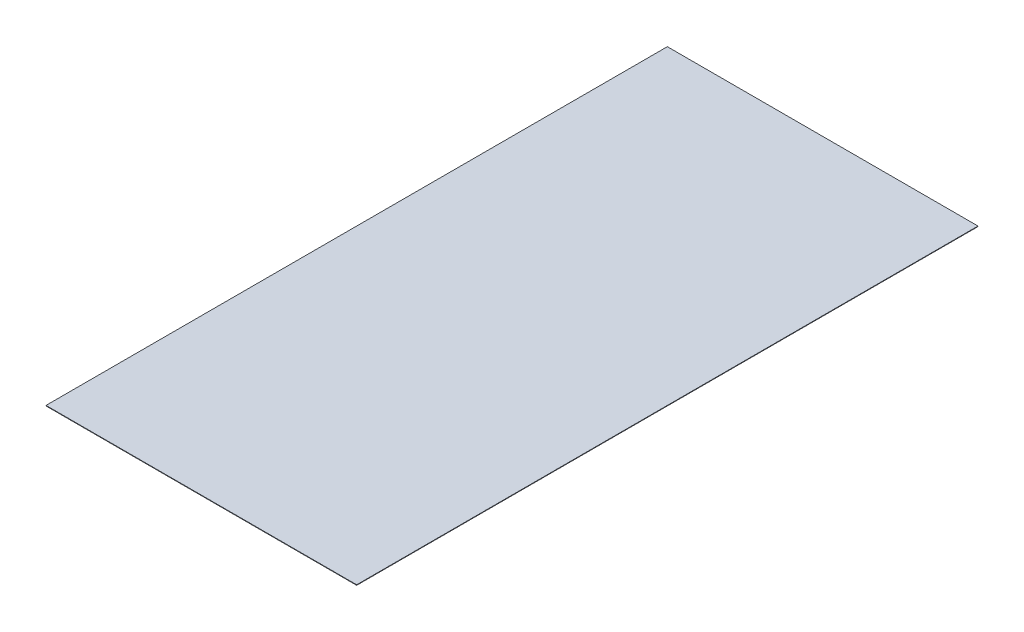
ISO-10303-21;
HEADER;
FILE_DESCRIPTION(('STEP AP214'),'2;1');
FILE_NAME('part.step','',(''),(''),'','','');
FILE_SCHEMA(('AUTOMOTIVE_DESIGN { 1 0 10303 214 1 1 1 1 }'));
ENDSEC;
DATA;
#1=APPLICATION_CONTEXT('core data for automotive mechanical design processes');
#2=APPLICATION_PROTOCOL_DEFINITION('international standard','automotive_design',2000,#1);
#3=PRODUCT_CONTEXT('',#1,'mechanical');
#4=PRODUCT('Part','Part','',(#3));
#5=PRODUCT_RELATED_PRODUCT_CATEGORY('part','',(#4));
#6=PRODUCT_DEFINITION_FORMATION('','',#4);
#7=PRODUCT_DEFINITION_CONTEXT('part definition',#1,'design');
#8=PRODUCT_DEFINITION('design','',#6,#7);
#9=PRODUCT_DEFINITION_SHAPE('','',#8);
#10=(LENGTH_UNIT() NAMED_UNIT(*) SI_UNIT(.MILLI.,.METRE.));
#11=(NAMED_UNIT(*) PLANE_ANGLE_UNIT() SI_UNIT($,.RADIAN.));
#12=(NAMED_UNIT(*) SI_UNIT($,.STERADIAN.) SOLID_ANGLE_UNIT());
#13=UNCERTAINTY_MEASURE_WITH_UNIT(LENGTH_MEASURE(1.E-05),#10,'distance_accuracy_value','');
#14=(GEOMETRIC_REPRESENTATION_CONTEXT(3) GLOBAL_UNCERTAINTY_ASSIGNED_CONTEXT((#13)) GLOBAL_UNIT_ASSIGNED_CONTEXT((#10,
#11,#12)) REPRESENTATION_CONTEXT('',''));
#15=CARTESIAN_POINT('',(0.,0.,0.));
#16=DIRECTION('',(0.,0.,1.));
#17=DIRECTION('',(1.,0.,0.));
#18=AXIS2_PLACEMENT_3D('',#15,#16,#17);
#19=CARTESIAN_POINT('',(609.6,1.9,1219.2));
#20=DIRECTION('',(-1.,0.,0.));
#21=DIRECTION('',(0.,0.,1.));
#22=AXIS2_PLACEMENT_3D('',#19,#20,#21);
#23=PLANE('',#22);
#24=DIRECTION('',(0.,0.,-1.));
#25=VECTOR('',#24,1.);
#26=CARTESIAN_POINT('',(609.6,0.,1219.2));
#27=LINE('',#26,#25);
#28=CARTESIAN_POINT('',(609.6,0.,1219.2));
#29=VERTEX_POINT('',#28);
#30=CARTESIAN_POINT('',(609.6,0.,-1219.2));
#31=VERTEX_POINT('',#30);
#32=EDGE_CURVE('E96',#29,#31,#27,.T.);
#33=ORIENTED_EDGE('',*,*,#32,.T.);
#34=DIRECTION('',(0.,-1.,0.));
#35=VECTOR('',#34,1.);
#36=CARTESIAN_POINT('',(609.6,1.9,-1219.2));
#37=LINE('',#36,#35);
#38=CARTESIAN_POINT('',(609.6,1.9,-1219.2));
#39=VERTEX_POINT('',#38);
#40=EDGE_CURVE('E11',#39,#31,#37,.T.);
#41=ORIENTED_EDGE('',*,*,#40,.F.);
#42=DIRECTION('',(0.,0.,-1.));
#43=VECTOR('',#42,1.);
#44=CARTESIAN_POINT('',(609.6,1.9,1219.2));
#45=LINE('',#44,#43);
#46=CARTESIAN_POINT('',(609.6,1.9,1219.2));
#47=VERTEX_POINT('',#46);
#48=EDGE_CURVE('E84',#47,#39,#45,.T.);
#49=ORIENTED_EDGE('',*,*,#48,.F.);
#50=DIRECTION('',(0.,-1.,0.));
#51=VECTOR('',#50,1.);
#52=CARTESIAN_POINT('',(609.6,1.9,1219.2));
#53=LINE('',#52,#51);
#54=EDGE_CURVE('E92',#47,#29,#53,.T.);
#55=ORIENTED_EDGE('',*,*,#54,.T.);
#56=EDGE_LOOP('',(#33,#41,#49,#55));
#57=FACE_BOUND('',#56,.T.);
#58=ADVANCED_FACE('F33',(#57),#23,.F.);
#59=CARTESIAN_POINT('',(-609.6,1.9,-1219.2));
#60=DIRECTION('',(0.,0.,1.));
#61=DIRECTION('',(1.,0.,0.));
#62=AXIS2_PLACEMENT_3D('',#59,#60,#61);
#63=PLANE('',#62);
#64=DIRECTION('',(-1.,0.,0.));
#65=VECTOR('',#64,1.);
#66=CARTESIAN_POINT('',(-609.6,0.,-1219.2));
#67=LINE('',#66,#65);
#68=CARTESIAN_POINT('',(-609.6,0.,-1219.2));
#69=VERTEX_POINT('',#68);
#70=EDGE_CURVE('E88',#31,#69,#67,.T.);
#71=ORIENTED_EDGE('',*,*,#70,.T.);
#72=DIRECTION('',(0.,-1.,0.));
#73=VECTOR('',#72,1.);
#74=CARTESIAN_POINT('',(-609.6,1.9,-1219.2));
#75=LINE('',#74,#73);
#76=CARTESIAN_POINT('',(-609.6,1.9,-1219.2));
#77=VERTEX_POINT('',#76);
#78=EDGE_CURVE('E41',#77,#69,#75,.T.);
#79=ORIENTED_EDGE('',*,*,#78,.F.);
#80=DIRECTION('',(-1.,0.,0.));
#81=VECTOR('',#80,1.);
#82=CARTESIAN_POINT('',(-609.6,1.9,-1219.2));
#83=LINE('',#82,#81);
#84=EDGE_CURVE('E79',#39,#77,#83,.T.);
#85=ORIENTED_EDGE('',*,*,#84,.F.);
#86=ORIENTED_EDGE('',*,*,#40,.T.);
#87=EDGE_LOOP('',(#71,#79,#85,#86));
#88=FACE_BOUND('',#87,.T.);
#89=ADVANCED_FACE('F87',(#88),#63,.F.);
#90=CARTESIAN_POINT('',(-609.6,1.9,1219.2));
#91=DIRECTION('',(1.,0.,0.));
#92=DIRECTION('',(0.,0.,-1.));
#93=AXIS2_PLACEMENT_3D('',#90,#91,#92);
#94=PLANE('',#93);
#95=DIRECTION('',(0.,0.,1.));
#96=VECTOR('',#95,1.);
#97=CARTESIAN_POINT('',(-609.6,0.,1219.2));
#98=LINE('',#97,#96);
#99=CARTESIAN_POINT('',(-609.6,0.,1219.2));
#100=VERTEX_POINT('',#99);
#101=EDGE_CURVE('E66',#69,#100,#98,.T.);
#102=ORIENTED_EDGE('',*,*,#101,.T.);
#103=DIRECTION('',(0.,-1.,0.));
#104=VECTOR('',#103,1.);
#105=CARTESIAN_POINT('',(-609.6,1.9,1219.2));
#106=LINE('',#105,#104);
#107=CARTESIAN_POINT('',(-609.6,1.9,1219.2));
#108=VERTEX_POINT('',#107);
#109=EDGE_CURVE('E89',#108,#100,#106,.T.);
#110=ORIENTED_EDGE('',*,*,#109,.F.);
#111=DIRECTION('',(0.,0.,1.));
#112=VECTOR('',#111,1.);
#113=CARTESIAN_POINT('',(-609.6,1.9,1219.2));
#114=LINE('',#113,#112);
#115=EDGE_CURVE('E82',#77,#108,#114,.T.);
#116=ORIENTED_EDGE('',*,*,#115,.F.);
#117=ORIENTED_EDGE('',*,*,#78,.T.);
#118=EDGE_LOOP('',(#102,#110,#116,#117));
#119=FACE_BOUND('',#118,.T.);
#120=ADVANCED_FACE('F90',(#119),#94,.F.);
#121=CARTESIAN_POINT('',(-609.6,1.9,1219.2));
#122=DIRECTION('',(0.,0.,-1.));
#123=DIRECTION('',(-1.,0.,0.));
#124=AXIS2_PLACEMENT_3D('',#121,#122,#123);
#125=PLANE('',#124);
#126=DIRECTION('',(1.,0.,0.));
#127=VECTOR('',#126,1.);
#128=CARTESIAN_POINT('',(-609.6,0.,1219.2));
#129=LINE('',#128,#127);
#130=EDGE_CURVE('E72',#100,#29,#129,.T.);
#131=ORIENTED_EDGE('',*,*,#130,.T.);
#132=ORIENTED_EDGE('',*,*,#54,.F.);
#133=DIRECTION('',(1.,0.,0.));
#134=VECTOR('',#133,1.);
#135=CARTESIAN_POINT('',(-609.6,1.9,1219.2));
#136=LINE('',#135,#134);
#137=EDGE_CURVE('E49',#108,#47,#136,.T.);
#138=ORIENTED_EDGE('',*,*,#137,.F.);
#139=ORIENTED_EDGE('',*,*,#109,.T.);
#140=EDGE_LOOP('',(#131,#132,#138,#139));
#141=FACE_BOUND('',#140,.T.);
#142=ADVANCED_FACE('F103',(#141),#125,.F.);
#143=CARTESIAN_POINT('',(0.,1.9,0.));
#144=DIRECTION('',(0.,-1.,0.));
#145=DIRECTION('',(0.,0.,-1.));
#146=AXIS2_PLACEMENT_3D('',#143,#144,#145);
#147=PLANE('',#146);
#148=ORIENTED_EDGE('',*,*,#48,.T.);
#149=ORIENTED_EDGE('',*,*,#84,.T.);
#150=ORIENTED_EDGE('',*,*,#115,.T.);
#151=ORIENTED_EDGE('',*,*,#137,.T.);
#152=EDGE_LOOP('',(#148,#149,#150,#151));
#153=FACE_BOUND('',#152,.T.);
#154=ADVANCED_FACE('F80',(#153),#147,.F.);
#155=CARTESIAN_POINT('',(0.,0.,0.));
#156=DIRECTION('',(0.,-1.,0.));
#157=DIRECTION('',(0.,0.,-1.));
#158=AXIS2_PLACEMENT_3D('',#155,#156,#157);
#159=PLANE('',#158);
#160=ORIENTED_EDGE('',*,*,#32,.F.);
#161=ORIENTED_EDGE('',*,*,#130,.F.);
#162=ORIENTED_EDGE('',*,*,#101,.F.);
#163=ORIENTED_EDGE('',*,*,#70,.F.);
#164=EDGE_LOOP('',(#160,#161,#162,#163));
#165=FACE_BOUND('',#164,.T.);
#166=ADVANCED_FACE('F106',(#165),#159,.T.);
#167=CLOSED_SHELL('',(#58,#89,#120,#142,#154,#166));
#168=MANIFOLD_SOLID_BREP('B2',#167);
#169=ADVANCED_BREP_SHAPE_REPRESENTATION('',(#18,#168),#14);
#170=SHAPE_DEFINITION_REPRESENTATION(#9,#169);
ENDSEC;
END-ISO-10303-21;
